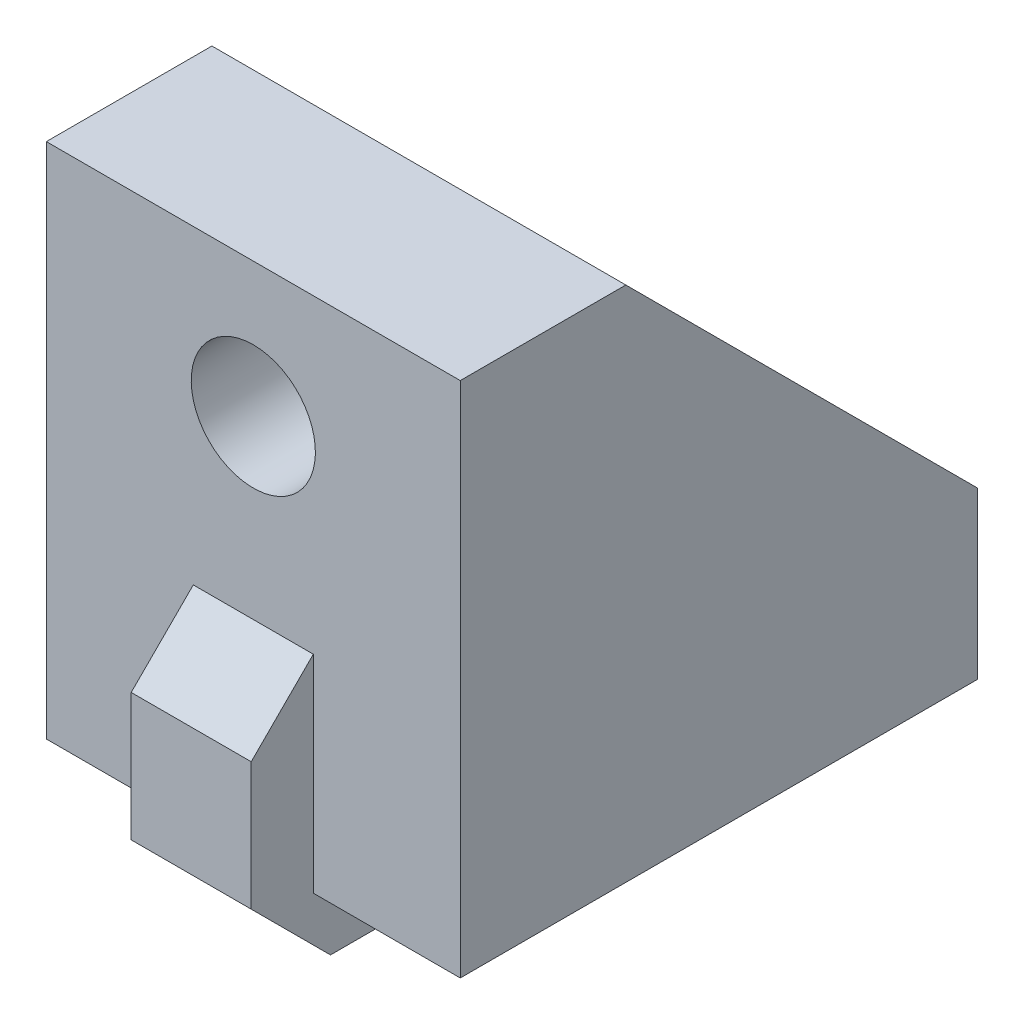
ISO-10303-21;
HEADER;
FILE_DESCRIPTION(('STEP AP214'),'2;1');
FILE_NAME('part.step','',(''),(''),'','','');
FILE_SCHEMA(('AUTOMOTIVE_DESIGN { 1 0 10303 214 1 1 1 1 }'));
ENDSEC;
DATA;
#1=APPLICATION_CONTEXT('core data for automotive mechanical design processes');
#2=APPLICATION_PROTOCOL_DEFINITION('international standard','automotive_design',2000,#1);
#3=PRODUCT_CONTEXT('',#1,'mechanical');
#4=PRODUCT('Part','Part','',(#3));
#5=PRODUCT_RELATED_PRODUCT_CATEGORY('part','',(#4));
#6=PRODUCT_DEFINITION_FORMATION('','',#4);
#7=PRODUCT_DEFINITION_CONTEXT('part definition',#1,'design');
#8=PRODUCT_DEFINITION('design','',#6,#7);
#9=PRODUCT_DEFINITION_SHAPE('','',#8);
#10=(LENGTH_UNIT() NAMED_UNIT(*) SI_UNIT(.MILLI.,.METRE.));
#11=(NAMED_UNIT(*) PLANE_ANGLE_UNIT() SI_UNIT($,.RADIAN.));
#12=(NAMED_UNIT(*) SI_UNIT($,.STERADIAN.) SOLID_ANGLE_UNIT());
#13=UNCERTAINTY_MEASURE_WITH_UNIT(LENGTH_MEASURE(1.E-05),#10,'distance_accuracy_value','');
#14=(GEOMETRIC_REPRESENTATION_CONTEXT(3) GLOBAL_UNCERTAINTY_ASSIGNED_CONTEXT((#13)) GLOBAL_UNIT_ASSIGNED_CONTEXT((#10,
#11,#12)) REPRESENTATION_CONTEXT('',''));
#15=CARTESIAN_POINT('',(0.,0.,0.));
#16=DIRECTION('',(0.,0.,1.));
#17=DIRECTION('',(1.,0.,0.));
#18=AXIS2_PLACEMENT_3D('',#15,#16,#17);
#19=CARTESIAN_POINT('',(10.,-12.,12.));
#20=DIRECTION('',(0.,-1.,0.));
#21=DIRECTION('',(0.,0.,-1.));
#22=AXIS2_PLACEMENT_3D('',#19,#20,#21);
#23=PLANE('',#22);
#24=CARTESIAN_POINT('',(0.,-12.,1.5));
#25=DIRECTION('',(0.,1.,0.));
#26=DIRECTION('',(0.,0.,1.));
#27=AXIS2_PLACEMENT_3D('',#24,#25,#26);
#28=CIRCLE('',#27,5.25);
#29=CARTESIAN_POINT('',(0.,-12.,6.75));
#30=VERTEX_POINT('',#29);
#31=EDGE_CURVE('E480',#30,#30,#28,.T.);
#32=ORIENTED_EDGE('',*,*,#31,.F.);
#33=EDGE_LOOP('',(#32));
#34=FACE_BOUND('',#33,.T.);
#35=DIRECTION('',(0.,0.,-1.));
#36=VECTOR('',#35,1.);
#37=CARTESIAN_POINT('',(-5.5,-12.,12.));
#38=LINE('',#37,#36);
#39=CARTESIAN_POINT('',(-5.5,-12.,12.));
#40=VERTEX_POINT('',#39);
#41=CARTESIAN_POINT('',(-5.5,-12.,-5.));
#42=VERTEX_POINT('',#41);
#43=EDGE_CURVE('E181',#40,#42,#38,.T.);
#44=ORIENTED_EDGE('',*,*,#43,.F.);
#45=DIRECTION('',(-1.,0.,0.));
#46=VECTOR('',#45,1.);
#47=CARTESIAN_POINT('',(10.,-12.,12.));
#48=LINE('',#47,#46);
#49=CARTESIAN_POINT('',(5.5,-12.,12.));
#50=VERTEX_POINT('',#49);
#51=EDGE_CURVE('E224',#50,#40,#48,.T.);
#52=ORIENTED_EDGE('',*,*,#51,.F.);
#53=DIRECTION('',(0.,0.,1.));
#54=VECTOR('',#53,1.);
#55=CARTESIAN_POINT('',(5.5,-12.,12.));
#56=LINE('',#55,#54);
#57=CARTESIAN_POINT('',(5.5,-12.,-5.));
#58=VERTEX_POINT('',#57);
#59=EDGE_CURVE('E191',#58,#50,#56,.T.);
#60=ORIENTED_EDGE('',*,*,#59,.F.);
#61=DIRECTION('',(-1.,0.,0.));
#62=VECTOR('',#61,1.);
#63=CARTESIAN_POINT('',(10.,-12.,-5.));
#64=LINE('',#63,#62);
#65=EDGE_CURVE('E42',#58,#42,#64,.T.);
#66=ORIENTED_EDGE('',*,*,#65,.T.);
#67=EDGE_LOOP('',(#44,#52,#60,#66));
#68=FACE_BOUND('',#67,.T.);
#69=ADVANCED_FACE('F34',(#34,#68),#23,.F.);
#70=CARTESIAN_POINT('',(10.,5.,12.));
#71=DIRECTION('',(0.,0.,1.));
#72=DIRECTION('',(0.,-1.,0.));
#73=AXIS2_PLACEMENT_3D('',#70,#71,#72);
#74=PLANE('',#73);
#75=CARTESIAN_POINT('',(0.,-1.50000000000001,12.));
#76=DIRECTION('',(0.,0.,-1.));
#77=DIRECTION('',(0.,1.,0.));
#78=AXIS2_PLACEMENT_3D('',#75,#76,#77);
#79=CIRCLE('',#78,5.25);
#80=CARTESIAN_POINT('',(0.,3.75,12.));
#81=VERTEX_POINT('',#80);
#82=EDGE_CURVE('E495',#81,#81,#79,.T.);
#83=ORIENTED_EDGE('',*,*,#82,.F.);
#84=EDGE_LOOP('',(#83));
#85=FACE_BOUND('',#84,.T.);
#86=DIRECTION('',(0.,-1.,0.));
#87=VECTOR('',#86,1.);
#88=CARTESIAN_POINT('',(-5.5,5.,12.));
#89=LINE('',#88,#87);
#90=CARTESIAN_POINT('',(-5.5,5.,12.));
#91=VERTEX_POINT('',#90);
#92=EDGE_CURVE('E178',#91,#40,#89,.T.);
#93=ORIENTED_EDGE('',*,*,#92,.F.);
#94=DIRECTION('',(-1.,0.,0.));
#95=VECTOR('',#94,1.);
#96=CARTESIAN_POINT('',(10.,5.,12.));
#97=LINE('',#96,#95);
#98=CARTESIAN_POINT('',(5.5,5.,12.));
#99=VERTEX_POINT('',#98);
#100=EDGE_CURVE('E221',#99,#91,#97,.T.);
#101=ORIENTED_EDGE('',*,*,#100,.F.);
#102=DIRECTION('',(0.,1.,0.));
#103=VECTOR('',#102,1.);
#104=CARTESIAN_POINT('',(5.5,5.,12.));
#105=LINE('',#104,#103);
#106=EDGE_CURVE('E187',#50,#99,#105,.T.);
#107=ORIENTED_EDGE('',*,*,#106,.F.);
#108=ORIENTED_EDGE('',*,*,#51,.T.);
#109=EDGE_LOOP('',(#93,#101,#107,#108));
#110=FACE_BOUND('',#109,.T.);
#111=ADVANCED_FACE('F264',(#85,#110),#74,.F.);
#112=CARTESIAN_POINT('',(10.,-12.,-5.));
#113=DIRECTION('',(0.,0.,1.));
#114=DIRECTION('',(0.,-1.,0.));
#115=AXIS2_PLACEMENT_3D('',#112,#113,#114);
#116=PLANE('',#115);
#117=DIRECTION('',(-1.,0.,0.));
#118=VECTOR('',#117,1.);
#119=CARTESIAN_POINT('',(10.,-12.,-5.));
#120=LINE('',#119,#118);
#121=CARTESIAN_POINT('',(-10.,-12.,-5.));
#122=VERTEX_POINT('',#121);
#123=EDGE_CURVE('E175',#42,#122,#120,.T.);
#124=ORIENTED_EDGE('',*,*,#123,.F.);
#125=ORIENTED_EDGE('',*,*,#65,.F.);
#126=CARTESIAN_POINT('',(10.,-12.,-5.));
#127=VERTEX_POINT('',#126);
#128=EDGE_CURVE('E11',#127,#58,#64,.T.);
#129=ORIENTED_EDGE('',*,*,#128,.F.);
#130=DIRECTION('',(0.,1.,0.));
#131=VECTOR('',#130,1.);
#132=CARTESIAN_POINT('',(10.,-12.,-5.));
#133=LINE('',#132,#131);
#134=CARTESIAN_POINT('',(10.,-20.,-5.));
#135=VERTEX_POINT('',#134);
#136=EDGE_CURVE('E194',#135,#127,#133,.T.);
#137=ORIENTED_EDGE('',*,*,#136,.F.);
#138=DIRECTION('',(-1.,0.,0.));
#139=VECTOR('',#138,1.);
#140=CARTESIAN_POINT('',(10.,-20.,-5.));
#141=LINE('',#140,#139);
#142=CARTESIAN_POINT('',(-10.,-20.,-5.));
#143=VERTEX_POINT('',#142);
#144=EDGE_CURVE('E204',#135,#143,#141,.T.);
#145=ORIENTED_EDGE('',*,*,#144,.T.);
#146=DIRECTION('',(0.,1.,0.));
#147=VECTOR('',#146,1.);
#148=CARTESIAN_POINT('',(-10.,-12.,-5.));
#149=LINE('',#148,#147);
#150=EDGE_CURVE('E193',#143,#122,#149,.T.);
#151=ORIENTED_EDGE('',*,*,#150,.T.);
#152=EDGE_LOOP('',(#124,#125,#129,#137,#145,#151));
#153=FACE_BOUND('',#152,.T.);
#154=ADVANCED_FACE('F36',(#153),#116,.F.);
#155=CARTESIAN_POINT('',(10.,5.,20.));
#156=DIRECTION('',(0.,-1.,0.));
#157=DIRECTION('',(0.,0.,-1.));
#158=AXIS2_PLACEMENT_3D('',#155,#156,#157);
#159=PLANE('',#158);
#160=DIRECTION('',(0.,0.,1.));
#161=VECTOR('',#160,1.);
#162=CARTESIAN_POINT('',(-10.,5.,20.));
#163=LINE('',#162,#161);
#164=CARTESIAN_POINT('',(-10.,5.,12.));
#165=VERTEX_POINT('',#164);
#166=CARTESIAN_POINT('',(-10.,5.,20.));
#167=VERTEX_POINT('',#166);
#168=EDGE_CURVE('E206',#165,#167,#163,.T.);
#169=ORIENTED_EDGE('',*,*,#168,.T.);
#170=DIRECTION('',(-1.,0.,0.));
#171=VECTOR('',#170,1.);
#172=CARTESIAN_POINT('',(10.,5.,20.));
#173=LINE('',#172,#171);
#174=CARTESIAN_POINT('',(10.,5.,20.));
#175=VERTEX_POINT('',#174);
#176=EDGE_CURVE('E219',#175,#167,#173,.T.);
#177=ORIENTED_EDGE('',*,*,#176,.F.);
#178=DIRECTION('',(0.,0.,1.));
#179=VECTOR('',#178,1.);
#180=CARTESIAN_POINT('',(10.,5.,20.));
#181=LINE('',#180,#179);
#182=CARTESIAN_POINT('',(10.,5.,12.));
#183=VERTEX_POINT('',#182);
#184=EDGE_CURVE('E197',#183,#175,#181,.T.);
#185=ORIENTED_EDGE('',*,*,#184,.F.);
#186=EDGE_CURVE('E222',#183,#99,#97,.T.);
#187=ORIENTED_EDGE('',*,*,#186,.T.);
#188=ORIENTED_EDGE('',*,*,#100,.T.);
#189=DIRECTION('',(1.,0.,0.));
#190=VECTOR('',#189,1.);
#191=CARTESIAN_POINT('',(10.,5.,12.));
#192=LINE('',#191,#190);
#193=EDGE_CURVE('E171',#165,#91,#192,.T.);
#194=ORIENTED_EDGE('',*,*,#193,.F.);
#195=EDGE_LOOP('',(#169,#177,#185,#187,#188,#194));
#196=FACE_BOUND('',#195,.T.);
#197=ADVANCED_FACE('F244',(#196),#159,.F.);
#198=CARTESIAN_POINT('',(10.,5.,20.));
#199=DIRECTION('',(0.,0.,-1.));
#200=DIRECTION('',(0.,1.,0.));
#201=AXIS2_PLACEMENT_3D('',#198,#199,#200);
#202=PLANE('',#201);
#203=CARTESIAN_POINT('',(0.,-1.50000000000001,20.));
#204=DIRECTION('',(0.,0.,-1.));
#205=DIRECTION('',(0.,1.,0.));
#206=AXIS2_PLACEMENT_3D('',#203,#204,#205);
#207=CIRCLE('',#206,3.);
#208=CARTESIAN_POINT('',(0.,1.49999999999999,20.));
#209=VERTEX_POINT('',#208);
#210=EDGE_CURVE('E492',#209,#209,#207,.T.);
#211=ORIENTED_EDGE('',*,*,#210,.T.);
#212=EDGE_LOOP('',(#211));
#213=FACE_BOUND('',#212,.T.);
#214=DIRECTION('',(-1.,0.,0.));
#215=VECTOR('',#214,1.);
#216=CARTESIAN_POINT('',(2.9,-10.,20.));
#217=LINE('',#216,#215);
#218=CARTESIAN_POINT('',(2.9,-10.,20.));
#219=VERTEX_POINT('',#218);
#220=CARTESIAN_POINT('',(-2.9,-10.,20.));
#221=VERTEX_POINT('',#220);
#222=EDGE_CURVE('E49',#219,#221,#217,.T.);
#223=ORIENTED_EDGE('',*,*,#222,.F.);
#224=DIRECTION('',(0.,1.,0.));
#225=VECTOR('',#224,1.);
#226=CARTESIAN_POINT('',(2.9,-10.,20.));
#227=LINE('',#226,#225);
#228=CARTESIAN_POINT('',(2.9,-20.,20.));
#229=VERTEX_POINT('',#228);
#230=EDGE_CURVE('E155',#229,#219,#227,.T.);
#231=ORIENTED_EDGE('',*,*,#230,.F.);
#232=DIRECTION('',(-1.,0.,0.));
#233=VECTOR('',#232,1.);
#234=CARTESIAN_POINT('',(10.,-20.,20.));
#235=LINE('',#234,#233);
#236=CARTESIAN_POINT('',(10.,-20.,20.));
#237=VERTEX_POINT('',#236);
#238=EDGE_CURVE('E216',#237,#229,#235,.T.);
#239=ORIENTED_EDGE('',*,*,#238,.F.);
#240=DIRECTION('',(0.,-1.,0.));
#241=VECTOR('',#240,1.);
#242=CARTESIAN_POINT('',(10.,5.,20.));
#243=LINE('',#242,#241);
#244=EDGE_CURVE('E200',#175,#237,#243,.T.);
#245=ORIENTED_EDGE('',*,*,#244,.F.);
#246=ORIENTED_EDGE('',*,*,#176,.T.);
#247=DIRECTION('',(0.,-1.,0.));
#248=VECTOR('',#247,1.);
#249=CARTESIAN_POINT('',(-10.,5.,20.));
#250=LINE('',#249,#248);
#251=CARTESIAN_POINT('',(-10.,-20.,20.));
#252=VERTEX_POINT('',#251);
#253=EDGE_CURVE('E209',#167,#252,#250,.T.);
#254=ORIENTED_EDGE('',*,*,#253,.T.);
#255=CARTESIAN_POINT('',(-2.9,-20.,20.));
#256=VERTEX_POINT('',#255);
#257=EDGE_CURVE('E215',#256,#252,#235,.T.);
#258=ORIENTED_EDGE('',*,*,#257,.F.);
#259=DIRECTION('',(0.,1.,0.));
#260=VECTOR('',#259,1.);
#261=CARTESIAN_POINT('',(-2.9,-10.,20.));
#262=LINE('',#261,#260);
#263=EDGE_CURVE('E54',#256,#221,#262,.T.);
#264=ORIENTED_EDGE('',*,*,#263,.T.);
#265=EDGE_LOOP('',(#223,#231,#239,#245,#246,#254,#258,#264));
#266=FACE_BOUND('',#265,.T.);
#267=ADVANCED_FACE('F252',(#213,#266),#202,.F.);
#268=CARTESIAN_POINT('',(10.,-20.,20.));
#269=DIRECTION('',(0.,1.,0.));
#270=DIRECTION('',(0.,0.,1.));
#271=AXIS2_PLACEMENT_3D('',#268,#269,#270);
#272=PLANE('',#271);
#273=CARTESIAN_POINT('',(0.,-20.,1.5));
#274=DIRECTION('',(0.,1.,0.));
#275=DIRECTION('',(0.,0.,1.));
#276=AXIS2_PLACEMENT_3D('',#273,#274,#275);
#277=CIRCLE('',#276,3.);
#278=CARTESIAN_POINT('',(0.,-20.,4.5));
#279=VERTEX_POINT('',#278);
#280=EDGE_CURVE('E479',#279,#279,#277,.T.);
#281=ORIENTED_EDGE('',*,*,#280,.T.);
#282=EDGE_LOOP('',(#281));
#283=FACE_BOUND('',#282,.T.);
#284=ORIENTED_EDGE('',*,*,#238,.T.);
#285=DIRECTION('',(0.,0.,1.));
#286=VECTOR('',#285,1.);
#287=CARTESIAN_POINT('',(2.9,-20.,20.));
#288=LINE('',#287,#286);
#289=CARTESIAN_POINT('',(2.9,-20.,10.));
#290=VERTEX_POINT('',#289);
#291=EDGE_CURVE('E507',#290,#229,#288,.T.);
#292=ORIENTED_EDGE('',*,*,#291,.F.);
#293=DIRECTION('',(-1.,0.,0.));
#294=VECTOR('',#293,1.);
#295=CARTESIAN_POINT('',(2.9,-20.,10.));
#296=LINE('',#295,#294);
#297=CARTESIAN_POINT('',(-2.9,-20.,10.));
#298=VERTEX_POINT('',#297);
#299=EDGE_CURVE('E524',#290,#298,#296,.T.);
#300=ORIENTED_EDGE('',*,*,#299,.T.);
#301=DIRECTION('',(0.,0.,1.));
#302=VECTOR('',#301,1.);
#303=CARTESIAN_POINT('',(-2.9,-20.,20.));
#304=LINE('',#303,#302);
#305=EDGE_CURVE('E520',#298,#256,#304,.T.);
#306=ORIENTED_EDGE('',*,*,#305,.T.);
#307=ORIENTED_EDGE('',*,*,#257,.T.);
#308=DIRECTION('',(0.,0.,-1.));
#309=VECTOR('',#308,1.);
#310=CARTESIAN_POINT('',(-10.,-20.,20.));
#311=LINE('',#310,#309);
#312=EDGE_CURVE('E198',#252,#143,#311,.T.);
#313=ORIENTED_EDGE('',*,*,#312,.T.);
#314=ORIENTED_EDGE('',*,*,#144,.F.);
#315=DIRECTION('',(0.,0.,-1.));
#316=VECTOR('',#315,1.);
#317=CARTESIAN_POINT('',(10.,-20.,20.));
#318=LINE('',#317,#316);
#319=EDGE_CURVE('E202',#237,#135,#318,.T.);
#320=ORIENTED_EDGE('',*,*,#319,.F.);
#321=EDGE_LOOP('',(#284,#292,#300,#306,#307,#313,#314,#320));
#322=FACE_BOUND('',#321,.T.);
#323=ADVANCED_FACE('F288',(#283,#322),#272,.F.);
#324=CARTESIAN_POINT('',(10.,0.,0.));
#325=DIRECTION('',(1.,0.,0.));
#326=DIRECTION('',(0.,0.,-1.));
#327=AXIS2_PLACEMENT_3D('',#324,#325,#326);
#328=PLANE('',#327);
#329=ORIENTED_EDGE('',*,*,#136,.T.);
#330=DIRECTION('',(0.,-0.707106781186547,-0.707106781186548));
#331=VECTOR('',#330,1.);
#332=CARTESIAN_POINT('',(10.,5.,12.));
#333=LINE('',#332,#331);
#334=EDGE_CURVE('E185',#183,#127,#333,.T.);
#335=ORIENTED_EDGE('',*,*,#334,.F.);
#336=ORIENTED_EDGE('',*,*,#184,.T.);
#337=ORIENTED_EDGE('',*,*,#244,.T.);
#338=ORIENTED_EDGE('',*,*,#319,.T.);
#339=EDGE_LOOP('',(#329,#335,#336,#337,#338));
#340=FACE_BOUND('',#339,.T.);
#341=ADVANCED_FACE('F258',(#340),#328,.T.);
#342=CARTESIAN_POINT('',(-10.,0.,0.));
#343=DIRECTION('',(1.,0.,0.));
#344=DIRECTION('',(0.,0.,-1.));
#345=AXIS2_PLACEMENT_3D('',#342,#343,#344);
#346=PLANE('',#345);
#347=ORIENTED_EDGE('',*,*,#168,.F.);
#348=DIRECTION('',(0.,-0.707106781186547,-0.707106781186548));
#349=VECTOR('',#348,1.);
#350=CARTESIAN_POINT('',(-10.,5.,12.));
#351=LINE('',#350,#349);
#352=EDGE_CURVE('E164',#165,#122,#351,.T.);
#353=ORIENTED_EDGE('',*,*,#352,.T.);
#354=ORIENTED_EDGE('',*,*,#150,.F.);
#355=ORIENTED_EDGE('',*,*,#312,.F.);
#356=ORIENTED_EDGE('',*,*,#253,.F.);
#357=EDGE_LOOP('',(#347,#353,#354,#355,#356));
#358=FACE_BOUND('',#357,.T.);
#359=ADVANCED_FACE('F249',(#358),#346,.F.);
#360=CARTESIAN_POINT('',(5.5,-7.5,7.50000000000001));
#361=DIRECTION('',(1.,0.,0.));
#362=DIRECTION('',(0.,0.,-1.));
#363=AXIS2_PLACEMENT_3D('',#360,#361,#362);
#364=PLANE('',#363);
#365=DIRECTION('',(0.,-0.707106781186547,-0.707106781186548));
#366=VECTOR('',#365,1.);
#367=CARTESIAN_POINT('',(5.5,5.,12.));
#368=LINE('',#367,#366);
#369=EDGE_CURVE('E184',#99,#58,#368,.T.);
#370=ORIENTED_EDGE('',*,*,#369,.T.);
#371=ORIENTED_EDGE('',*,*,#59,.T.);
#372=ORIENTED_EDGE('',*,*,#106,.T.);
#373=EDGE_LOOP('',(#370,#371,#372));
#374=FACE_BOUND('',#373,.T.);
#375=ADVANCED_FACE('F265',(#374),#364,.F.);
#376=CARTESIAN_POINT('',(10.,5.,12.));
#377=DIRECTION('',(0.,-0.707106781186548,0.707106781186547));
#378=DIRECTION('',(0.,-0.707106781186547,-0.707106781186548));
#379=AXIS2_PLACEMENT_3D('',#376,#377,#378);
#380=PLANE('',#379);
#381=ORIENTED_EDGE('',*,*,#128,.T.);
#382=ORIENTED_EDGE('',*,*,#369,.F.);
#383=ORIENTED_EDGE('',*,*,#186,.F.);
#384=ORIENTED_EDGE('',*,*,#334,.T.);
#385=EDGE_LOOP('',(#381,#382,#383,#384));
#386=FACE_BOUND('',#385,.T.);
#387=ADVANCED_FACE('F262',(#386),#380,.F.);
#388=CARTESIAN_POINT('',(-5.5,-7.5,7.5));
#389=DIRECTION('',(-1.,0.,0.));
#390=DIRECTION('',(0.,0.,1.));
#391=AXIS2_PLACEMENT_3D('',#388,#389,#390);
#392=PLANE('',#391);
#393=ORIENTED_EDGE('',*,*,#92,.T.);
#394=ORIENTED_EDGE('',*,*,#43,.T.);
#395=DIRECTION('',(0.,-0.707106781186547,-0.707106781186548));
#396=VECTOR('',#395,1.);
#397=CARTESIAN_POINT('',(-5.5,5.,12.));
#398=LINE('',#397,#396);
#399=EDGE_CURVE('E161',#91,#42,#398,.T.);
#400=ORIENTED_EDGE('',*,*,#399,.F.);
#401=EDGE_LOOP('',(#393,#394,#400));
#402=FACE_BOUND('',#401,.T.);
#403=ADVANCED_FACE('F237',(#402),#392,.F.);
#404=CARTESIAN_POINT('',(-10.,5.,12.));
#405=DIRECTION('',(0.,0.707106781186548,-0.707106781186547));
#406=DIRECTION('',(0.,-0.707106781186547,-0.707106781186548));
#407=AXIS2_PLACEMENT_3D('',#404,#405,#406);
#408=PLANE('',#407);
#409=ORIENTED_EDGE('',*,*,#399,.T.);
#410=ORIENTED_EDGE('',*,*,#123,.T.);
#411=ORIENTED_EDGE('',*,*,#352,.F.);
#412=ORIENTED_EDGE('',*,*,#193,.T.);
#413=EDGE_LOOP('',(#409,#410,#411,#412));
#414=FACE_BOUND('',#413,.T.);
#415=ADVANCED_FACE('F239',(#414),#408,.T.);
#416=CARTESIAN_POINT('',(2.9,-10.,20.));
#417=DIRECTION('',(0.,-0.707106781186549,-0.707106781186546));
#418=DIRECTION('',(0.,0.707106781186546,-0.707106781186549));
#419=AXIS2_PLACEMENT_3D('',#416,#417,#418);
#420=PLANE('',#419);
#421=DIRECTION('',(0.,-0.707106781186546,0.707106781186549));
#422=VECTOR('',#421,1.);
#423=CARTESIAN_POINT('',(-2.9,-10.,20.));
#424=LINE('',#423,#422);
#425=CARTESIAN_POINT('',(-2.9,-13.,23.));
#426=VERTEX_POINT('',#425);
#427=EDGE_CURVE('E160',#221,#426,#424,.T.);
#428=ORIENTED_EDGE('',*,*,#427,.T.);
#429=DIRECTION('',(-1.,0.,0.));
#430=VECTOR('',#429,1.);
#431=CARTESIAN_POINT('',(2.9,-13.,23.));
#432=LINE('',#431,#430);
#433=CARTESIAN_POINT('',(2.9,-13.,23.));
#434=VERTEX_POINT('',#433);
#435=EDGE_CURVE('E143',#434,#426,#432,.T.);
#436=ORIENTED_EDGE('',*,*,#435,.F.);
#437=DIRECTION('',(0.,-0.707106781186546,0.707106781186549));
#438=VECTOR('',#437,1.);
#439=CARTESIAN_POINT('',(2.9,-10.,20.));
#440=LINE('',#439,#438);
#441=EDGE_CURVE('E150',#219,#434,#440,.T.);
#442=ORIENTED_EDGE('',*,*,#441,.F.);
#443=ORIENTED_EDGE('',*,*,#222,.T.);
#444=EDGE_LOOP('',(#428,#436,#442,#443));
#445=FACE_BOUND('',#444,.T.);
#446=ADVANCED_FACE('F158',(#445),#420,.F.);
#447=CARTESIAN_POINT('',(2.9,-13.,23.));
#448=DIRECTION('',(0.,0.,-1.));
#449=DIRECTION('',(-1.,0.,0.));
#450=AXIS2_PLACEMENT_3D('',#447,#448,#449);
#451=PLANE('',#450);
#452=DIRECTION('',(0.,-1.,0.));
#453=VECTOR('',#452,1.);
#454=CARTESIAN_POINT('',(-2.9,-13.,23.));
#455=LINE('',#454,#453);
#456=CARTESIAN_POINT('',(-2.9,-19.1707779737572,23.));
#457=VERTEX_POINT('',#456);
#458=EDGE_CURVE('E511',#426,#457,#455,.T.);
#459=ORIENTED_EDGE('',*,*,#458,.T.);
#460=DIRECTION('',(-1.,0.,0.));
#461=VECTOR('',#460,1.);
#462=CARTESIAN_POINT('',(2.9,-19.1707779737572,23.));
#463=LINE('',#462,#461);
#464=CARTESIAN_POINT('',(2.9,-19.1707779737572,23.));
#465=VERTEX_POINT('',#464);
#466=EDGE_CURVE('E146',#465,#457,#463,.T.);
#467=ORIENTED_EDGE('',*,*,#466,.F.);
#468=DIRECTION('',(0.,-1.,0.));
#469=VECTOR('',#468,1.);
#470=CARTESIAN_POINT('',(2.9,-13.,23.));
#471=LINE('',#470,#469);
#472=EDGE_CURVE('E139',#434,#465,#471,.T.);
#473=ORIENTED_EDGE('',*,*,#472,.F.);
#474=ORIENTED_EDGE('',*,*,#435,.T.);
#475=EDGE_LOOP('',(#459,#467,#473,#474));
#476=FACE_BOUND('',#475,.T.);
#477=ADVANCED_FACE('F141',(#476),#451,.F.);
#478=CARTESIAN_POINT('',(2.9,-19.1707779737572,23.));
#479=DIRECTION('',(0.,0.707106781186548,-0.707106781186547));
#480=DIRECTION('',(0.,0.707106781186547,0.707106781186548));
#481=AXIS2_PLACEMENT_3D('',#478,#479,#480);
#482=PLANE('',#481);
#483=DIRECTION('',(0.,-0.707106781186547,-0.707106781186548));
#484=VECTOR('',#483,1.);
#485=CARTESIAN_POINT('',(-2.9,-19.1707779737572,23.));
#486=LINE('',#485,#484);
#487=CARTESIAN_POINT('',(-2.9,-23.,19.1707779737572));
#488=VERTEX_POINT('',#487);
#489=EDGE_CURVE('E513',#457,#488,#486,.T.);
#490=ORIENTED_EDGE('',*,*,#489,.T.);
#491=DIRECTION('',(-1.,0.,0.));
#492=VECTOR('',#491,1.);
#493=CARTESIAN_POINT('',(2.9,-23.,19.1707779737572));
#494=LINE('',#493,#492);
#495=CARTESIAN_POINT('',(2.9,-23.,19.1707779737572));
#496=VERTEX_POINT('',#495);
#497=EDGE_CURVE('E166',#496,#488,#494,.T.);
#498=ORIENTED_EDGE('',*,*,#497,.F.);
#499=DIRECTION('',(0.,-0.707106781186547,-0.707106781186548));
#500=VECTOR('',#499,1.);
#501=CARTESIAN_POINT('',(2.9,-19.1707779737572,23.));
#502=LINE('',#501,#500);
#503=EDGE_CURVE('E149',#465,#496,#502,.T.);
#504=ORIENTED_EDGE('',*,*,#503,.F.);
#505=ORIENTED_EDGE('',*,*,#466,.T.);
#506=EDGE_LOOP('',(#490,#498,#504,#505));
#507=FACE_BOUND('',#506,.T.);
#508=ADVANCED_FACE('F340',(#507),#482,.F.);
#509=CARTESIAN_POINT('',(2.9,-23.,19.1707779737572));
#510=DIRECTION('',(0.,1.,0.));
#511=DIRECTION('',(0.,0.,1.));
#512=AXIS2_PLACEMENT_3D('',#509,#510,#511);
#513=PLANE('',#512);
#514=DIRECTION('',(0.,0.,-1.));
#515=VECTOR('',#514,1.);
#516=CARTESIAN_POINT('',(-2.9,-23.,19.1707779737572));
#517=LINE('',#516,#515);
#518=CARTESIAN_POINT('',(-2.9,-23.,13.));
#519=VERTEX_POINT('',#518);
#520=EDGE_CURVE('E515',#488,#519,#517,.T.);
#521=ORIENTED_EDGE('',*,*,#520,.T.);
#522=DIRECTION('',(-1.,0.,0.));
#523=VECTOR('',#522,1.);
#524=CARTESIAN_POINT('',(2.9,-23.,13.));
#525=LINE('',#524,#523);
#526=CARTESIAN_POINT('',(2.9,-23.,13.));
#527=VERTEX_POINT('',#526);
#528=EDGE_CURVE('E526',#527,#519,#525,.T.);
#529=ORIENTED_EDGE('',*,*,#528,.F.);
#530=DIRECTION('',(0.,0.,-1.));
#531=VECTOR('',#530,1.);
#532=CARTESIAN_POINT('',(2.9,-23.,19.1707779737572));
#533=LINE('',#532,#531);
#534=EDGE_CURVE('E502',#496,#527,#533,.T.);
#535=ORIENTED_EDGE('',*,*,#534,.F.);
#536=ORIENTED_EDGE('',*,*,#497,.T.);
#537=EDGE_LOOP('',(#521,#529,#535,#536));
#538=FACE_BOUND('',#537,.T.);
#539=ADVANCED_FACE('F349',(#538),#513,.F.);
#540=CARTESIAN_POINT('',(2.9,-20.,10.));
#541=DIRECTION('',(0.,0.70710678118655,0.707106781186545));
#542=DIRECTION('',(0.,-0.707106781186545,0.70710678118655));
#543=AXIS2_PLACEMENT_3D('',#540,#541,#542);
#544=PLANE('',#543);
#545=DIRECTION('',(0.,0.707106781186545,-0.70710678118655));
#546=VECTOR('',#545,1.);
#547=CARTESIAN_POINT('',(-2.9,-20.,10.));
#548=LINE('',#547,#546);
#549=EDGE_CURVE('E517',#519,#298,#548,.T.);
#550=ORIENTED_EDGE('',*,*,#549,.T.);
#551=ORIENTED_EDGE('',*,*,#299,.F.);
#552=DIRECTION('',(0.,0.707106781186545,-0.70710678118655));
#553=VECTOR('',#552,1.);
#554=CARTESIAN_POINT('',(2.9,-20.,10.));
#555=LINE('',#554,#553);
#556=EDGE_CURVE('E504',#527,#290,#555,.T.);
#557=ORIENTED_EDGE('',*,*,#556,.F.);
#558=ORIENTED_EDGE('',*,*,#528,.T.);
#559=EDGE_LOOP('',(#550,#551,#557,#558));
#560=FACE_BOUND('',#559,.T.);
#561=ADVANCED_FACE('F359',(#560),#544,.F.);
#562=CARTESIAN_POINT('',(2.9,0.,0.));
#563=DIRECTION('',(1.,0.,0.));
#564=DIRECTION('',(0.,0.,-1.));
#565=AXIS2_PLACEMENT_3D('',#562,#563,#564);
#566=PLANE('',#565);
#567=ORIENTED_EDGE('',*,*,#441,.T.);
#568=ORIENTED_EDGE('',*,*,#472,.T.);
#569=ORIENTED_EDGE('',*,*,#503,.T.);
#570=ORIENTED_EDGE('',*,*,#534,.T.);
#571=ORIENTED_EDGE('',*,*,#556,.T.);
#572=ORIENTED_EDGE('',*,*,#291,.T.);
#573=ORIENTED_EDGE('',*,*,#230,.T.);
#574=EDGE_LOOP('',(#567,#568,#569,#570,#571,#572,#573));
#575=FACE_BOUND('',#574,.T.);
#576=ADVANCED_FACE('F153',(#575),#566,.T.);
#577=CARTESIAN_POINT('',(-2.9,0.,0.));
#578=DIRECTION('',(1.,0.,0.));
#579=DIRECTION('',(0.,0.,-1.));
#580=AXIS2_PLACEMENT_3D('',#577,#578,#579);
#581=PLANE('',#580);
#582=ORIENTED_EDGE('',*,*,#427,.F.);
#583=ORIENTED_EDGE('',*,*,#263,.F.);
#584=ORIENTED_EDGE('',*,*,#305,.F.);
#585=ORIENTED_EDGE('',*,*,#549,.F.);
#586=ORIENTED_EDGE('',*,*,#520,.F.);
#587=ORIENTED_EDGE('',*,*,#489,.F.);
#588=ORIENTED_EDGE('',*,*,#458,.F.);
#589=EDGE_LOOP('',(#582,#583,#584,#585,#586,#587,#588));
#590=FACE_BOUND('',#589,.T.);
#591=ADVANCED_FACE('F378',(#590),#581,.F.);
#592=CARTESIAN_POINT('',(0.,-1.50000000000001,13.));
#593=DIRECTION('',(0.,0.,-1.));
#594=DIRECTION('',(0.,1.,0.));
#595=AXIS2_PLACEMENT_3D('',#592,#593,#594);
#596=CYLINDRICAL_SURFACE('',#595,5.25);
#597=CARTESIAN_POINT('',(0.,-1.50000000000001,13.));
#598=DIRECTION('',(0.,0.,-1.));
#599=DIRECTION('',(0.,1.,0.));
#600=AXIS2_PLACEMENT_3D('',#597,#598,#599);
#601=CIRCLE('',#600,5.25);
#602=CARTESIAN_POINT('',(0.,3.75,13.));
#603=VERTEX_POINT('',#602);
#604=EDGE_CURVE('E496',#603,#603,#601,.T.);
#605=ORIENTED_EDGE('',*,*,#604,.F.);
#606=EDGE_LOOP('',(#605));
#607=FACE_BOUND('',#606,.T.);
#608=ORIENTED_EDGE('',*,*,#82,.T.);
#609=EDGE_LOOP('',(#608));
#610=FACE_BOUND('',#609,.T.);
#611=ADVANCED_FACE('F387',(#607,#610),#596,.F.);
#612=CARTESIAN_POINT('',(0.,-1.50000000000001,13.));
#613=DIRECTION('',(0.,0.,-1.));
#614=DIRECTION('',(0.,1.,0.));
#615=AXIS2_PLACEMENT_3D('',#612,#613,#614);
#616=PLANE('',#615);
#617=CARTESIAN_POINT('',(0.,-1.5,13.));
#618=DIRECTION('',(0.,0.,-1.));
#619=DIRECTION('',(0.,1.,0.));
#620=AXIS2_PLACEMENT_3D('',#617,#618,#619);
#621=CIRCLE('',#620,3.);
#622=CARTESIAN_POINT('',(0.,1.5,13.));
#623=VERTEX_POINT('',#622);
#624=EDGE_CURVE('E488',#623,#623,#621,.T.);
#625=ORIENTED_EDGE('',*,*,#624,.F.);
#626=EDGE_LOOP('',(#625));
#627=FACE_BOUND('',#626,.T.);
#628=ORIENTED_EDGE('',*,*,#604,.T.);
#629=EDGE_LOOP('',(#628));
#630=FACE_BOUND('',#629,.T.);
#631=ADVANCED_FACE('F405',(#627,#630),#616,.T.);
#632=CARTESIAN_POINT('',(0.,-1.50000000000001,21.));
#633=DIRECTION('',(0.,0.,-1.));
#634=DIRECTION('',(0.,1.,0.));
#635=AXIS2_PLACEMENT_3D('',#632,#633,#634);
#636=CYLINDRICAL_SURFACE('',#635,3.);
#637=ORIENTED_EDGE('',*,*,#624,.T.);
#638=EDGE_LOOP('',(#637));
#639=FACE_BOUND('',#638,.T.);
#640=ORIENTED_EDGE('',*,*,#210,.F.);
#641=EDGE_LOOP('',(#640));
#642=FACE_BOUND('',#641,.T.);
#643=ADVANCED_FACE('F422',(#639,#642),#636,.F.);
#644=CARTESIAN_POINT('',(0.,-13.,1.5));
#645=DIRECTION('',(0.,1.,0.));
#646=DIRECTION('',(0.,0.,1.));
#647=AXIS2_PLACEMENT_3D('',#644,#645,#646);
#648=CYLINDRICAL_SURFACE('',#647,5.25);
#649=CARTESIAN_POINT('',(0.,-13.,1.5));
#650=DIRECTION('',(0.,1.,0.));
#651=DIRECTION('',(0.,0.,1.));
#652=AXIS2_PLACEMENT_3D('',#649,#650,#651);
#653=CIRCLE('',#652,5.25);
#654=CARTESIAN_POINT('',(0.,-13.,6.75));
#655=VERTEX_POINT('',#654);
#656=EDGE_CURVE('E483',#655,#655,#653,.T.);
#657=ORIENTED_EDGE('',*,*,#656,.F.);
#658=EDGE_LOOP('',(#657));
#659=FACE_BOUND('',#658,.T.);
#660=ORIENTED_EDGE('',*,*,#31,.T.);
#661=EDGE_LOOP('',(#660));
#662=FACE_BOUND('',#661,.T.);
#663=ADVANCED_FACE('F431',(#659,#662),#648,.F.);
#664=CARTESIAN_POINT('',(0.,-13.,1.5));
#665=DIRECTION('',(0.,1.,0.));
#666=DIRECTION('',(0.,0.,1.));
#667=AXIS2_PLACEMENT_3D('',#664,#665,#666);
#668=PLANE('',#667);
#669=CARTESIAN_POINT('',(0.,-13.,1.5));
#670=DIRECTION('',(0.,1.,0.));
#671=DIRECTION('',(0.,0.,1.));
#672=AXIS2_PLACEMENT_3D('',#669,#670,#671);
#673=CIRCLE('',#672,3.);
#674=CARTESIAN_POINT('',(0.,-13.,4.5));
#675=VERTEX_POINT('',#674);
#676=EDGE_CURVE('E476',#675,#675,#673,.T.);
#677=ORIENTED_EDGE('',*,*,#676,.F.);
#678=EDGE_LOOP('',(#677));
#679=FACE_BOUND('',#678,.T.);
#680=ORIENTED_EDGE('',*,*,#656,.T.);
#681=EDGE_LOOP('',(#680));
#682=FACE_BOUND('',#681,.T.);
#683=ADVANCED_FACE('F444',(#679,#682),#668,.T.);
#684=CARTESIAN_POINT('',(0.,-21.,1.5));
#685=DIRECTION('',(0.,1.,0.));
#686=DIRECTION('',(0.,0.,1.));
#687=AXIS2_PLACEMENT_3D('',#684,#685,#686);
#688=CYLINDRICAL_SURFACE('',#687,3.);
#689=ORIENTED_EDGE('',*,*,#676,.T.);
#690=EDGE_LOOP('',(#689));
#691=FACE_BOUND('',#690,.T.);
#692=ORIENTED_EDGE('',*,*,#280,.F.);
#693=EDGE_LOOP('',(#692));
#694=FACE_BOUND('',#693,.T.);
#695=ADVANCED_FACE('F459',(#691,#694),#688,.F.);
#696=CLOSED_SHELL('',(#69,#111,#154,#197,#267,#323,#341,#359,#375,#387,#403,#415,#446,#477,#508,
#539,#561,#576,#591,#611,#631,#643,#663,#683,#695));
#697=MANIFOLD_SOLID_BREP('B2',#696);
#698=ADVANCED_BREP_SHAPE_REPRESENTATION('',(#18,#697),#14);
#699=SHAPE_DEFINITION_REPRESENTATION(#9,#698);
ENDSEC;
END-ISO-10303-21;
